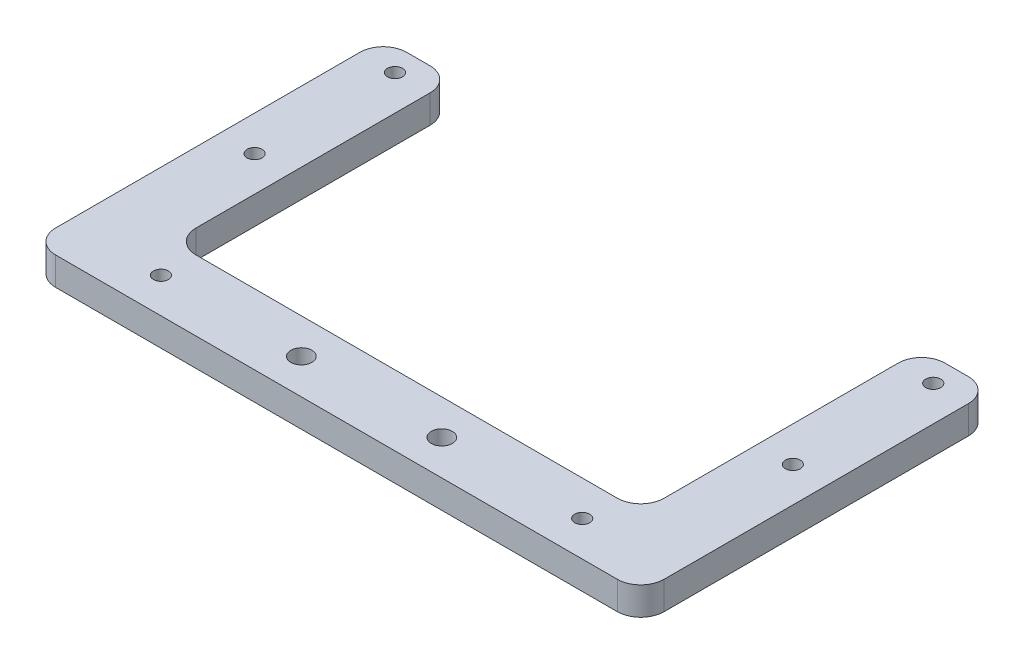
ISO-10303-21;
HEADER;
FILE_DESCRIPTION(('STEP AP214'),'2;1');
FILE_NAME('part.step','',(''),(''),'','','');
FILE_SCHEMA(('AUTOMOTIVE_DESIGN { 1 0 10303 214 1 1 1 1 }'));
ENDSEC;
DATA;
#1=APPLICATION_CONTEXT('core data for automotive mechanical design processes');
#2=APPLICATION_PROTOCOL_DEFINITION('international standard','automotive_design',2000,#1);
#3=PRODUCT_CONTEXT('',#1,'mechanical');
#4=PRODUCT('Part','Part','',(#3));
#5=PRODUCT_RELATED_PRODUCT_CATEGORY('part','',(#4));
#6=PRODUCT_DEFINITION_FORMATION('','',#4);
#7=PRODUCT_DEFINITION_CONTEXT('part definition',#1,'design');
#8=PRODUCT_DEFINITION('design','',#6,#7);
#9=PRODUCT_DEFINITION_SHAPE('','',#8);
#10=(LENGTH_UNIT() NAMED_UNIT(*) SI_UNIT(.MILLI.,.METRE.));
#11=(NAMED_UNIT(*) PLANE_ANGLE_UNIT() SI_UNIT($,.RADIAN.));
#12=(NAMED_UNIT(*) SI_UNIT($,.STERADIAN.) SOLID_ANGLE_UNIT());
#13=UNCERTAINTY_MEASURE_WITH_UNIT(LENGTH_MEASURE(1.E-05),#10,'distance_accuracy_value','');
#14=(GEOMETRIC_REPRESENTATION_CONTEXT(3) GLOBAL_UNCERTAINTY_ASSIGNED_CONTEXT((#13)) GLOBAL_UNIT_ASSIGNED_CONTEXT((#10,
#11,#12)) REPRESENTATION_CONTEXT('',''));
#15=CARTESIAN_POINT('',(0.,0.,0.));
#16=DIRECTION('',(0.,0.,1.));
#17=DIRECTION('',(1.,0.,0.));
#18=AXIS2_PLACEMENT_3D('',#15,#16,#17);
#19=CARTESIAN_POINT('',(0.,6.,0.));
#20=DIRECTION('',(0.,0.,1.));
#21=DIRECTION('',(1.,0.,0.));
#22=AXIS2_PLACEMENT_3D('',#19,#20,#21);
#23=PLANE('',#22);
#24=DIRECTION('',(-1.,0.,0.));
#25=VECTOR('',#24,1.);
#26=CARTESIAN_POINT('',(0.,6.,0.));
#27=LINE('',#26,#25);
#28=CARTESIAN_POINT('',(45.,6.,0.));
#29=VERTEX_POINT('',#28);
#30=CARTESIAN_POINT('',(-45.,6.,0.));
#31=VERTEX_POINT('',#30);
#32=EDGE_CURVE('E190',#29,#31,#27,.T.);
#33=ORIENTED_EDGE('',*,*,#32,.F.);
#34=DIRECTION('',(0.,-1.,0.));
#35=VECTOR('',#34,1.);
#36=CARTESIAN_POINT('',(45.,6.,0.));
#37=LINE('',#36,#35);
#38=CARTESIAN_POINT('',(45.,0.,0.));
#39=VERTEX_POINT('',#38);
#40=EDGE_CURVE('E218',#29,#39,#37,.T.);
#41=ORIENTED_EDGE('',*,*,#40,.T.);
#42=DIRECTION('',(-1.,0.,0.));
#43=VECTOR('',#42,1.);
#44=CARTESIAN_POINT('',(0.,0.,0.));
#45=LINE('',#44,#43);
#46=CARTESIAN_POINT('',(-45.,0.,0.));
#47=VERTEX_POINT('',#46);
#48=EDGE_CURVE('E176',#39,#47,#45,.T.);
#49=ORIENTED_EDGE('',*,*,#48,.T.);
#50=DIRECTION('',(0.,-1.,0.));
#51=VECTOR('',#50,1.);
#52=CARTESIAN_POINT('',(-45.,6.,0.));
#53=LINE('',#52,#51);
#54=EDGE_CURVE('E154',#47,#31,#53,.F.);
#55=ORIENTED_EDGE('',*,*,#54,.T.);
#56=EDGE_LOOP('',(#33,#41,#49,#55));
#57=FACE_BOUND('',#56,.T.);
#58=ADVANCED_FACE('F33',(#57),#23,.F.);
#59=CARTESIAN_POINT('',(-50.,6.,0.));
#60=DIRECTION('',(-1.,0.,0.));
#61=DIRECTION('',(0.,0.,1.));
#62=AXIS2_PLACEMENT_3D('',#59,#60,#61);
#63=PLANE('',#62);
#64=DIRECTION('',(0.,0.,-1.));
#65=VECTOR('',#64,1.);
#66=CARTESIAN_POINT('',(-50.,6.,0.));
#67=LINE('',#66,#65);
#68=CARTESIAN_POINT('',(-50.,6.,-4.99999999999999));
#69=VERTEX_POINT('',#68);
#70=CARTESIAN_POINT('',(-50.,6.,-55.));
#71=VERTEX_POINT('',#70);
#72=EDGE_CURVE('E168',#69,#71,#67,.T.);
#73=ORIENTED_EDGE('',*,*,#72,.F.);
#74=DIRECTION('',(0.,-1.,0.));
#75=VECTOR('',#74,1.);
#76=CARTESIAN_POINT('',(-50.,0.,-4.99999999999999));
#77=LINE('',#76,#75);
#78=CARTESIAN_POINT('',(-50.,0.,-4.99999999999999));
#79=VERTEX_POINT('',#78);
#80=EDGE_CURVE('E152',#69,#79,#77,.T.);
#81=ORIENTED_EDGE('',*,*,#80,.T.);
#82=DIRECTION('',(0.,0.,-1.));
#83=VECTOR('',#82,1.);
#84=CARTESIAN_POINT('',(-50.,0.,0.));
#85=LINE('',#84,#83);
#86=CARTESIAN_POINT('',(-50.,0.,-55.));
#87=VERTEX_POINT('',#86);
#88=EDGE_CURVE('E165',#79,#87,#85,.T.);
#89=ORIENTED_EDGE('',*,*,#88,.T.);
#90=DIRECTION('',(0.,-1.,0.));
#91=VECTOR('',#90,1.);
#92=CARTESIAN_POINT('',(-50.,6.,-55.));
#93=LINE('',#92,#91);
#94=EDGE_CURVE('E169',#87,#71,#93,.F.);
#95=ORIENTED_EDGE('',*,*,#94,.T.);
#96=EDGE_LOOP('',(#73,#81,#89,#95));
#97=FACE_BOUND('',#96,.T.);
#98=ADVANCED_FACE('F164',(#97),#63,.F.);
#99=CARTESIAN_POINT('',(-50.,6.,-60.));
#100=DIRECTION('',(0.,0.,1.));
#101=DIRECTION('',(1.,0.,0.));
#102=AXIS2_PLACEMENT_3D('',#99,#100,#101);
#103=PLANE('',#102);
#104=DIRECTION('',(-1.,0.,0.));
#105=VECTOR('',#104,1.);
#106=CARTESIAN_POINT('',(-50.,0.,-60.));
#107=LINE('',#106,#105);
#108=CARTESIAN_POINT('',(-55.,0.,-60.));
#109=VERTEX_POINT('',#108);
#110=CARTESIAN_POINT('',(-60.,0.,-60.));
#111=VERTEX_POINT('',#110);
#112=EDGE_CURVE('E175',#109,#111,#107,.T.);
#113=ORIENTED_EDGE('',*,*,#112,.T.);
#114=DIRECTION('',(0.,-1.,0.));
#115=VECTOR('',#114,1.);
#116=CARTESIAN_POINT('',(-60.,6.,-60.));
#117=LINE('',#116,#115);
#118=CARTESIAN_POINT('',(-60.,6.,-60.));
#119=VERTEX_POINT('',#118);
#120=EDGE_CURVE('E159',#111,#119,#117,.F.);
#121=ORIENTED_EDGE('',*,*,#120,.T.);
#122=DIRECTION('',(-1.,0.,0.));
#123=VECTOR('',#122,1.);
#124=CARTESIAN_POINT('',(-50.,6.,-60.));
#125=LINE('',#124,#123);
#126=CARTESIAN_POINT('',(-55.,6.,-60.));
#127=VERTEX_POINT('',#126);
#128=EDGE_CURVE('E269',#127,#119,#125,.T.);
#129=ORIENTED_EDGE('',*,*,#128,.F.);
#130=DIRECTION('',(0.,-1.,0.));
#131=VECTOR('',#130,1.);
#132=CARTESIAN_POINT('',(-55.,6.,-60.));
#133=LINE('',#132,#131);
#134=EDGE_CURVE('E213',#127,#109,#133,.T.);
#135=ORIENTED_EDGE('',*,*,#134,.T.);
#136=EDGE_LOOP('',(#113,#121,#129,#135));
#137=FACE_BOUND('',#136,.T.);
#138=ADVANCED_FACE('F359',(#137),#103,.F.);
#139=CARTESIAN_POINT('',(-65.,6.,-60.));
#140=DIRECTION('',(1.,0.,0.));
#141=DIRECTION('',(0.,0.,-1.));
#142=AXIS2_PLACEMENT_3D('',#139,#140,#141);
#143=PLANE('',#142);
#144=DIRECTION('',(0.,0.,1.));
#145=VECTOR('',#144,1.);
#146=CARTESIAN_POINT('',(-65.,0.,-60.));
#147=LINE('',#146,#145);
#148=CARTESIAN_POINT('',(-65.,0.,-55.));
#149=VERTEX_POINT('',#148);
#150=CARTESIAN_POINT('',(-65.,0.,10.));
#151=VERTEX_POINT('',#150);
#152=EDGE_CURVE('E179',#149,#151,#147,.T.);
#153=ORIENTED_EDGE('',*,*,#152,.T.);
#154=DIRECTION('',(0.,-1.,0.));
#155=VECTOR('',#154,1.);
#156=CARTESIAN_POINT('',(-65.,6.,10.));
#157=LINE('',#156,#155);
#158=CARTESIAN_POINT('',(-65.,6.,10.));
#159=VERTEX_POINT('',#158);
#160=EDGE_CURVE('E205',#151,#159,#157,.F.);
#161=ORIENTED_EDGE('',*,*,#160,.T.);
#162=DIRECTION('',(0.,0.,1.));
#163=VECTOR('',#162,1.);
#164=CARTESIAN_POINT('',(-65.,6.,-60.));
#165=LINE('',#164,#163);
#166=CARTESIAN_POINT('',(-65.,6.,-55.));
#167=VERTEX_POINT('',#166);
#168=EDGE_CURVE('E277',#167,#159,#165,.T.);
#169=ORIENTED_EDGE('',*,*,#168,.F.);
#170=DIRECTION('',(0.,-1.,0.));
#171=VECTOR('',#170,1.);
#172=CARTESIAN_POINT('',(-65.,6.,-55.));
#173=LINE('',#172,#171);
#174=EDGE_CURVE('E202',#167,#149,#173,.T.);
#175=ORIENTED_EDGE('',*,*,#174,.T.);
#176=EDGE_LOOP('',(#153,#161,#169,#175));
#177=FACE_BOUND('',#176,.T.);
#178=ADVANCED_FACE('F458',(#177),#143,.F.);
#179=CARTESIAN_POINT('',(-65.,6.,15.));
#180=DIRECTION('',(0.,0.,-1.));
#181=DIRECTION('',(-1.,0.,0.));
#182=AXIS2_PLACEMENT_3D('',#179,#180,#181);
#183=PLANE('',#182);
#184=DIRECTION('',(1.,0.,0.));
#185=VECTOR('',#184,1.);
#186=CARTESIAN_POINT('',(-65.,0.,15.));
#187=LINE('',#186,#185);
#188=CARTESIAN_POINT('',(-60.,0.,15.));
#189=VERTEX_POINT('',#188);
#190=CARTESIAN_POINT('',(60.,0.,15.));
#191=VERTEX_POINT('',#190);
#192=EDGE_CURVE('E187',#189,#191,#187,.T.);
#193=ORIENTED_EDGE('',*,*,#192,.T.);
#194=DIRECTION('',(0.,-1.,0.));
#195=VECTOR('',#194,1.);
#196=CARTESIAN_POINT('',(60.,6.,15.));
#197=LINE('',#196,#195);
#198=CARTESIAN_POINT('',(60.,6.,15.));
#199=VERTEX_POINT('',#198);
#200=EDGE_CURVE('E237',#191,#199,#197,.F.);
#201=ORIENTED_EDGE('',*,*,#200,.T.);
#202=DIRECTION('',(1.,0.,0.));
#203=VECTOR('',#202,1.);
#204=CARTESIAN_POINT('',(-65.,6.,15.));
#205=LINE('',#204,#203);
#206=CARTESIAN_POINT('',(-60.,6.,15.));
#207=VERTEX_POINT('',#206);
#208=EDGE_CURVE('E191',#207,#199,#205,.T.);
#209=ORIENTED_EDGE('',*,*,#208,.F.);
#210=DIRECTION('',(0.,-1.,0.));
#211=VECTOR('',#210,1.);
#212=CARTESIAN_POINT('',(-60.,6.,15.));
#213=LINE('',#212,#211);
#214=EDGE_CURVE('E194',#207,#189,#213,.T.);
#215=ORIENTED_EDGE('',*,*,#214,.T.);
#216=EDGE_LOOP('',(#193,#201,#209,#215));
#217=FACE_BOUND('',#216,.T.);
#218=ADVANCED_FACE('F332',(#217),#183,.F.);
#219=CARTESIAN_POINT('',(0.,6.,0.));
#220=DIRECTION('',(0.,1.,0.));
#221=DIRECTION('',(0.,0.,1.));
#222=AXIS2_PLACEMENT_3D('',#219,#220,#221);
#223=PLANE('',#222);
#224=CARTESIAN_POINT('',(15.,6.,7.5));
#225=DIRECTION('',(0.,-1.,0.));
#226=DIRECTION('',(0.,0.,1.));
#227=AXIS2_PLACEMENT_3D('',#224,#225,#226);
#228=CIRCLE('',#227,2.25);
#229=CARTESIAN_POINT('',(15.,6.,9.74999999999999));
#230=VERTEX_POINT('',#229);
#231=EDGE_CURVE('E300',#230,#230,#228,.T.);
#232=ORIENTED_EDGE('',*,*,#231,.T.);
#233=EDGE_LOOP('',(#232));
#234=FACE_BOUND('',#233,.T.);
#235=CARTESIAN_POINT('',(57.5,6.,-25.));
#236=DIRECTION('',(0.,-1.,0.));
#237=DIRECTION('',(0.,0.,1.));
#238=AXIS2_PLACEMENT_3D('',#235,#236,#237);
#239=CIRCLE('',#238,1.6);
#240=CARTESIAN_POINT('',(57.5,6.,-23.4));
#241=VERTEX_POINT('',#240);
#242=EDGE_CURVE('E402',#241,#241,#239,.T.);
#243=ORIENTED_EDGE('',*,*,#242,.T.);
#244=EDGE_LOOP('',(#243));
#245=FACE_BOUND('',#244,.T.);
#246=CARTESIAN_POINT('',(57.5,6.,-55.));
#247=DIRECTION('',(0.,-1.,0.));
#248=DIRECTION('',(0.,0.,1.));
#249=AXIS2_PLACEMENT_3D('',#246,#247,#248);
#250=CIRCLE('',#249,1.6);
#251=CARTESIAN_POINT('',(57.5,6.,-53.4));
#252=VERTEX_POINT('',#251);
#253=EDGE_CURVE('E389',#252,#252,#250,.T.);
#254=ORIENTED_EDGE('',*,*,#253,.T.);
#255=EDGE_LOOP('',(#254));
#256=FACE_BOUND('',#255,.T.);
#257=CARTESIAN_POINT('',(45.,6.,7.5));
#258=DIRECTION('',(0.,-1.,0.));
#259=DIRECTION('',(0.,0.,1.));
#260=AXIS2_PLACEMENT_3D('',#257,#258,#259);
#261=CIRCLE('',#260,1.6);
#262=CARTESIAN_POINT('',(45.,6.,9.1));
#263=VERTEX_POINT('',#262);
#264=EDGE_CURVE('E396',#263,#263,#261,.T.);
#265=ORIENTED_EDGE('',*,*,#264,.T.);
#266=EDGE_LOOP('',(#265));
#267=FACE_BOUND('',#266,.T.);
#268=CARTESIAN_POINT('',(-15.,6.,7.5));
#269=DIRECTION('',(0.,1.,0.));
#270=DIRECTION('',(0.,0.,1.));
#271=AXIS2_PLACEMENT_3D('',#268,#269,#270);
#272=CIRCLE('',#271,2.25);
#273=CARTESIAN_POINT('',(-15.,6.,9.74999999999999));
#274=VERTEX_POINT('',#273);
#275=EDGE_CURVE('E307',#274,#274,#272,.T.);
#276=ORIENTED_EDGE('',*,*,#275,.F.);
#277=EDGE_LOOP('',(#276));
#278=FACE_BOUND('',#277,.T.);
#279=CARTESIAN_POINT('',(-57.5,6.,-25.));
#280=DIRECTION('',(0.,1.,0.));
#281=DIRECTION('',(0.,0.,1.));
#282=AXIS2_PLACEMENT_3D('',#279,#280,#281);
#283=CIRCLE('',#282,1.6);
#284=CARTESIAN_POINT('',(-57.5,6.,-23.4));
#285=VERTEX_POINT('',#284);
#286=EDGE_CURVE('E314',#285,#285,#283,.T.);
#287=ORIENTED_EDGE('',*,*,#286,.F.);
#288=EDGE_LOOP('',(#287));
#289=FACE_BOUND('',#288,.T.);
#290=CARTESIAN_POINT('',(-57.5,6.,-55.));
#291=DIRECTION('',(0.,1.,0.));
#292=DIRECTION('',(0.,0.,1.));
#293=AXIS2_PLACEMENT_3D('',#290,#291,#292);
#294=CIRCLE('',#293,1.6);
#295=CARTESIAN_POINT('',(-57.5,6.,-53.4));
#296=VERTEX_POINT('',#295);
#297=EDGE_CURVE('E272',#296,#296,#294,.T.);
#298=ORIENTED_EDGE('',*,*,#297,.F.);
#299=EDGE_LOOP('',(#298));
#300=FACE_BOUND('',#299,.T.);
#301=CARTESIAN_POINT('',(-45.,6.,7.5));
#302=DIRECTION('',(0.,1.,0.));
#303=DIRECTION('',(0.,0.,1.));
#304=AXIS2_PLACEMENT_3D('',#301,#302,#303);
#305=CIRCLE('',#304,1.6);
#306=CARTESIAN_POINT('',(-45.,6.,9.1));
#307=VERTEX_POINT('',#306);
#308=EDGE_CURVE('E319',#307,#307,#305,.T.);
#309=ORIENTED_EDGE('',*,*,#308,.F.);
#310=EDGE_LOOP('',(#309));
#311=FACE_BOUND('',#310,.T.);
#312=ORIENTED_EDGE('',*,*,#208,.T.);
#313=CARTESIAN_POINT('',(60.,6.,10.));
#314=DIRECTION('',(0.,1.,0.));
#315=DIRECTION('',(0.,0.,1.));
#316=AXIS2_PLACEMENT_3D('',#313,#314,#315);
#317=CIRCLE('',#316,5.);
#318=CARTESIAN_POINT('',(65.,6.,10.));
#319=VERTEX_POINT('',#318);
#320=EDGE_CURVE('E242',#199,#319,#317,.T.);
#321=ORIENTED_EDGE('',*,*,#320,.T.);
#322=DIRECTION('',(0.,0.,1.));
#323=VECTOR('',#322,1.);
#324=CARTESIAN_POINT('',(65.,6.,-60.));
#325=LINE('',#324,#323);
#326=CARTESIAN_POINT('',(65.,6.,-55.));
#327=VERTEX_POINT('',#326);
#328=EDGE_CURVE('E258',#327,#319,#325,.T.);
#329=ORIENTED_EDGE('',*,*,#328,.F.);
#330=CARTESIAN_POINT('',(60.,6.,-55.));
#331=DIRECTION('',(0.,1.,0.));
#332=DIRECTION('',(0.,0.,1.));
#333=AXIS2_PLACEMENT_3D('',#330,#331,#332);
#334=CIRCLE('',#333,5.);
#335=CARTESIAN_POINT('',(60.,6.,-60.));
#336=VERTEX_POINT('',#335);
#337=EDGE_CURVE('E48',#327,#336,#334,.T.);
#338=ORIENTED_EDGE('',*,*,#337,.T.);
#339=DIRECTION('',(1.,0.,0.));
#340=VECTOR('',#339,1.);
#341=CARTESIAN_POINT('',(50.,6.,-60.));
#342=LINE('',#341,#340);
#343=CARTESIAN_POINT('',(55.,6.,-60.));
#344=VERTEX_POINT('',#343);
#345=EDGE_CURVE('E385',#344,#336,#342,.T.);
#346=ORIENTED_EDGE('',*,*,#345,.F.);
#347=CARTESIAN_POINT('',(55.,6.,-55.));
#348=DIRECTION('',(0.,1.,0.));
#349=DIRECTION('',(0.,0.,1.));
#350=AXIS2_PLACEMENT_3D('',#347,#348,#349);
#351=CIRCLE('',#350,5.);
#352=CARTESIAN_POINT('',(50.,6.,-55.));
#353=VERTEX_POINT('',#352);
#354=EDGE_CURVE('E239',#344,#353,#351,.T.);
#355=ORIENTED_EDGE('',*,*,#354,.T.);
#356=DIRECTION('',(0.,0.,-1.));
#357=VECTOR('',#356,1.);
#358=CARTESIAN_POINT('',(50.,6.,0.));
#359=LINE('',#358,#357);
#360=CARTESIAN_POINT('',(50.,6.,-5.00000000000001));
#361=VERTEX_POINT('',#360);
#362=EDGE_CURVE('E266',#361,#353,#359,.T.);
#363=ORIENTED_EDGE('',*,*,#362,.F.);
#364=CARTESIAN_POINT('',(45.,6.,-5.00000000000001));
#365=DIRECTION('',(0.,1.,0.));
#366=DIRECTION('',(0.,0.,1.));
#367=AXIS2_PLACEMENT_3D('',#364,#365,#366);
#368=CIRCLE('',#367,5.);
#369=EDGE_CURVE('E11',#361,#29,#368,.F.);
#370=ORIENTED_EDGE('',*,*,#369,.T.);
#371=ORIENTED_EDGE('',*,*,#32,.T.);
#372=CARTESIAN_POINT('',(-45.,6.,-4.99999999999999));
#373=DIRECTION('',(0.,1.,0.));
#374=DIRECTION('',(0.,0.,1.));
#375=AXIS2_PLACEMENT_3D('',#372,#373,#374);
#376=CIRCLE('',#375,5.);
#377=EDGE_CURVE('E158',#31,#69,#376,.F.);
#378=ORIENTED_EDGE('',*,*,#377,.T.);
#379=ORIENTED_EDGE('',*,*,#72,.T.);
#380=CARTESIAN_POINT('',(-55.,6.,-55.));
#381=DIRECTION('',(0.,1.,0.));
#382=DIRECTION('',(0.,0.,1.));
#383=AXIS2_PLACEMENT_3D('',#380,#381,#382);
#384=CIRCLE('',#383,5.);
#385=EDGE_CURVE('E207',#71,#127,#384,.T.);
#386=ORIENTED_EDGE('',*,*,#385,.T.);
#387=ORIENTED_EDGE('',*,*,#128,.T.);
#388=CARTESIAN_POINT('',(-60.,6.,-55.));
#389=DIRECTION('',(0.,1.,0.));
#390=DIRECTION('',(0.,0.,1.));
#391=AXIS2_PLACEMENT_3D('',#388,#389,#390);
#392=CIRCLE('',#391,5.);
#393=EDGE_CURVE('E209',#119,#167,#392,.T.);
#394=ORIENTED_EDGE('',*,*,#393,.T.);
#395=ORIENTED_EDGE('',*,*,#168,.T.);
#396=CARTESIAN_POINT('',(-60.,6.,10.));
#397=DIRECTION('',(0.,1.,0.));
#398=DIRECTION('',(0.,0.,1.));
#399=AXIS2_PLACEMENT_3D('',#396,#397,#398);
#400=CIRCLE('',#399,5.);
#401=EDGE_CURVE('E211',#159,#207,#400,.T.);
#402=ORIENTED_EDGE('',*,*,#401,.T.);
#403=EDGE_LOOP('',(#312,#321,#329,#338,#346,#355,#363,#370,#371,#378,#379,#386,#387,#394,#395,#402));
#404=FACE_BOUND('',#403,.T.);
#405=ADVANCED_FACE('F265',(#234,#245,#256,#267,#278,#289,#300,#311,#404),#223,.T.);
#406=CARTESIAN_POINT('',(0.,0.,0.));
#407=DIRECTION('',(0.,1.,0.));
#408=DIRECTION('',(0.,0.,1.));
#409=AXIS2_PLACEMENT_3D('',#406,#407,#408);
#410=PLANE('',#409);
#411=CARTESIAN_POINT('',(15.,0.,7.5));
#412=DIRECTION('',(0.,-1.,0.));
#413=DIRECTION('',(0.,0.,1.));
#414=AXIS2_PLACEMENT_3D('',#411,#412,#413);
#415=CIRCLE('',#414,2.25);
#416=CARTESIAN_POINT('',(15.,0.,9.74999999999999));
#417=VERTEX_POINT('',#416);
#418=EDGE_CURVE('E296',#417,#417,#415,.T.);
#419=ORIENTED_EDGE('',*,*,#418,.F.);
#420=EDGE_LOOP('',(#419));
#421=FACE_BOUND('',#420,.T.);
#422=CARTESIAN_POINT('',(57.5,0.,-25.));
#423=DIRECTION('',(0.,-1.,0.));
#424=DIRECTION('',(0.,0.,1.));
#425=AXIS2_PLACEMENT_3D('',#422,#423,#424);
#426=CIRCLE('',#425,1.6);
#427=CARTESIAN_POINT('',(57.5,0.,-23.4));
#428=VERTEX_POINT('',#427);
#429=EDGE_CURVE('E393',#428,#428,#426,.T.);
#430=ORIENTED_EDGE('',*,*,#429,.F.);
#431=EDGE_LOOP('',(#430));
#432=FACE_BOUND('',#431,.T.);
#433=CARTESIAN_POINT('',(57.5,0.,-55.));
#434=DIRECTION('',(0.,-1.,0.));
#435=DIRECTION('',(0.,0.,1.));
#436=AXIS2_PLACEMENT_3D('',#433,#434,#435);
#437=CIRCLE('',#436,1.6);
#438=CARTESIAN_POINT('',(57.5,0.,-53.4));
#439=VERTEX_POINT('',#438);
#440=EDGE_CURVE('E392',#439,#439,#437,.T.);
#441=ORIENTED_EDGE('',*,*,#440,.F.);
#442=EDGE_LOOP('',(#441));
#443=FACE_BOUND('',#442,.T.);
#444=CARTESIAN_POINT('',(45.,0.,7.5));
#445=DIRECTION('',(0.,-1.,0.));
#446=DIRECTION('',(0.,0.,1.));
#447=AXIS2_PLACEMENT_3D('',#444,#445,#446);
#448=CIRCLE('',#447,1.6);
#449=CARTESIAN_POINT('',(45.,0.,9.1));
#450=VERTEX_POINT('',#449);
#451=EDGE_CURVE('E399',#450,#450,#448,.T.);
#452=ORIENTED_EDGE('',*,*,#451,.F.);
#453=EDGE_LOOP('',(#452));
#454=FACE_BOUND('',#453,.T.);
#455=CARTESIAN_POINT('',(-15.,0.,7.5));
#456=DIRECTION('',(0.,1.,0.));
#457=DIRECTION('',(0.,0.,1.));
#458=AXIS2_PLACEMENT_3D('',#455,#456,#457);
#459=CIRCLE('',#458,2.25);
#460=CARTESIAN_POINT('',(-15.,0.,9.74999999999999));
#461=VERTEX_POINT('',#460);
#462=EDGE_CURVE('E181',#461,#461,#459,.T.);
#463=ORIENTED_EDGE('',*,*,#462,.T.);
#464=EDGE_LOOP('',(#463));
#465=FACE_BOUND('',#464,.T.);
#466=CARTESIAN_POINT('',(-57.5,0.,-25.));
#467=DIRECTION('',(0.,1.,0.));
#468=DIRECTION('',(0.,0.,1.));
#469=AXIS2_PLACEMENT_3D('',#466,#467,#468);
#470=CIRCLE('',#469,1.6);
#471=CARTESIAN_POINT('',(-57.5,0.,-23.4));
#472=VERTEX_POINT('',#471);
#473=EDGE_CURVE('E311',#472,#472,#470,.T.);
#474=ORIENTED_EDGE('',*,*,#473,.T.);
#475=EDGE_LOOP('',(#474));
#476=FACE_BOUND('',#475,.T.);
#477=CARTESIAN_POINT('',(-57.5,0.,-55.));
#478=DIRECTION('',(0.,1.,0.));
#479=DIRECTION('',(0.,0.,1.));
#480=AXIS2_PLACEMENT_3D('',#477,#478,#479);
#481=CIRCLE('',#480,1.6);
#482=CARTESIAN_POINT('',(-57.5,0.,-53.4));
#483=VERTEX_POINT('',#482);
#484=EDGE_CURVE('E321',#483,#483,#481,.T.);
#485=ORIENTED_EDGE('',*,*,#484,.T.);
#486=EDGE_LOOP('',(#485));
#487=FACE_BOUND('',#486,.T.);
#488=CARTESIAN_POINT('',(-45.,0.,7.5));
#489=DIRECTION('',(0.,1.,0.));
#490=DIRECTION('',(0.,0.,1.));
#491=AXIS2_PLACEMENT_3D('',#488,#489,#490);
#492=CIRCLE('',#491,1.6);
#493=CARTESIAN_POINT('',(-45.,0.,9.1));
#494=VERTEX_POINT('',#493);
#495=EDGE_CURVE('E310',#494,#494,#492,.T.);
#496=ORIENTED_EDGE('',*,*,#495,.T.);
#497=EDGE_LOOP('',(#496));
#498=FACE_BOUND('',#497,.T.);
#499=DIRECTION('',(0.,0.,1.));
#500=VECTOR('',#499,1.);
#501=CARTESIAN_POINT('',(65.,0.,-60.));
#502=LINE('',#501,#500);
#503=CARTESIAN_POINT('',(65.,0.,-55.));
#504=VERTEX_POINT('',#503);
#505=CARTESIAN_POINT('',(65.,0.,10.));
#506=VERTEX_POINT('',#505);
#507=EDGE_CURVE('E292',#504,#506,#502,.T.);
#508=ORIENTED_EDGE('',*,*,#507,.T.);
#509=CARTESIAN_POINT('',(60.,0.,10.));
#510=DIRECTION('',(0.,1.,0.));
#511=DIRECTION('',(0.,0.,1.));
#512=AXIS2_PLACEMENT_3D('',#509,#510,#511);
#513=CIRCLE('',#512,5.);
#514=EDGE_CURVE('E235',#506,#191,#513,.F.);
#515=ORIENTED_EDGE('',*,*,#514,.T.);
#516=ORIENTED_EDGE('',*,*,#192,.F.);
#517=CARTESIAN_POINT('',(-60.,0.,10.));
#518=DIRECTION('',(0.,1.,0.));
#519=DIRECTION('',(0.,0.,1.));
#520=AXIS2_PLACEMENT_3D('',#517,#518,#519);
#521=CIRCLE('',#520,5.);
#522=EDGE_CURVE('E200',#189,#151,#521,.F.);
#523=ORIENTED_EDGE('',*,*,#522,.T.);
#524=ORIENTED_EDGE('',*,*,#152,.F.);
#525=CARTESIAN_POINT('',(-60.,0.,-55.));
#526=DIRECTION('',(0.,1.,0.));
#527=DIRECTION('',(0.,0.,1.));
#528=AXIS2_PLACEMENT_3D('',#525,#526,#527);
#529=CIRCLE('',#528,5.);
#530=EDGE_CURVE('E198',#149,#111,#529,.F.);
#531=ORIENTED_EDGE('',*,*,#530,.T.);
#532=ORIENTED_EDGE('',*,*,#112,.F.);
#533=CARTESIAN_POINT('',(-55.,0.,-55.));
#534=DIRECTION('',(0.,1.,0.));
#535=DIRECTION('',(0.,0.,1.));
#536=AXIS2_PLACEMENT_3D('',#533,#534,#535);
#537=CIRCLE('',#536,5.);
#538=EDGE_CURVE('E174',#109,#87,#537,.F.);
#539=ORIENTED_EDGE('',*,*,#538,.T.);
#540=ORIENTED_EDGE('',*,*,#88,.F.);
#541=CARTESIAN_POINT('',(-45.,0.,-4.99999999999999));
#542=DIRECTION('',(0.,1.,0.));
#543=DIRECTION('',(0.,0.,1.));
#544=AXIS2_PLACEMENT_3D('',#541,#542,#543);
#545=CIRCLE('',#544,5.);
#546=EDGE_CURVE('E148',#79,#47,#545,.T.);
#547=ORIENTED_EDGE('',*,*,#546,.T.);
#548=ORIENTED_EDGE('',*,*,#48,.F.);
#549=CARTESIAN_POINT('',(45.,0.,-5.00000000000001));
#550=DIRECTION('',(0.,1.,0.));
#551=DIRECTION('',(0.,0.,1.));
#552=AXIS2_PLACEMENT_3D('',#549,#550,#551);
#553=CIRCLE('',#552,5.);
#554=CARTESIAN_POINT('',(50.,0.,-5.00000000000001));
#555=VERTEX_POINT('',#554);
#556=EDGE_CURVE('E41',#39,#555,#553,.T.);
#557=ORIENTED_EDGE('',*,*,#556,.T.);
#558=DIRECTION('',(0.,0.,-1.));
#559=VECTOR('',#558,1.);
#560=CARTESIAN_POINT('',(50.,0.,0.));
#561=LINE('',#560,#559);
#562=CARTESIAN_POINT('',(50.,0.,-55.));
#563=VERTEX_POINT('',#562);
#564=EDGE_CURVE('E249',#555,#563,#561,.T.);
#565=ORIENTED_EDGE('',*,*,#564,.T.);
#566=CARTESIAN_POINT('',(55.,0.,-55.));
#567=DIRECTION('',(0.,1.,0.));
#568=DIRECTION('',(0.,0.,1.));
#569=AXIS2_PLACEMENT_3D('',#566,#567,#568);
#570=CIRCLE('',#569,5.);
#571=CARTESIAN_POINT('',(55.,0.,-60.));
#572=VERTEX_POINT('',#571);
#573=EDGE_CURVE('E231',#563,#572,#570,.F.);
#574=ORIENTED_EDGE('',*,*,#573,.T.);
#575=DIRECTION('',(1.,0.,0.));
#576=VECTOR('',#575,1.);
#577=CARTESIAN_POINT('',(50.,0.,-60.));
#578=LINE('',#577,#576);
#579=CARTESIAN_POINT('',(60.,0.,-60.));
#580=VERTEX_POINT('',#579);
#581=EDGE_CURVE('E259',#572,#580,#578,.T.);
#582=ORIENTED_EDGE('',*,*,#581,.T.);
#583=CARTESIAN_POINT('',(60.,0.,-55.));
#584=DIRECTION('',(0.,1.,0.));
#585=DIRECTION('',(0.,0.,1.));
#586=AXIS2_PLACEMENT_3D('',#583,#584,#585);
#587=CIRCLE('',#586,5.);
#588=EDGE_CURVE('E233',#580,#504,#587,.F.);
#589=ORIENTED_EDGE('',*,*,#588,.T.);
#590=EDGE_LOOP('',(#508,#515,#516,#523,#524,#531,#532,#539,#540,#547,#548,#557,#565,#574,#582,#589));
#591=FACE_BOUND('',#590,.T.);
#592=ADVANCED_FACE('F172',(#421,#432,#443,#454,#465,#476,#487,#498,#591),#410,.F.);
#593=CARTESIAN_POINT('',(-45.,6.,-4.99999999999999));
#594=DIRECTION('',(0.,1.,0.));
#595=DIRECTION('',(0.,0.,1.));
#596=AXIS2_PLACEMENT_3D('',#593,#594,#595);
#597=CYLINDRICAL_SURFACE('',#596,5.);
#598=ORIENTED_EDGE('',*,*,#377,.F.);
#599=ORIENTED_EDGE('',*,*,#54,.F.);
#600=ORIENTED_EDGE('',*,*,#546,.F.);
#601=ORIENTED_EDGE('',*,*,#80,.F.);
#602=EDGE_LOOP('',(#598,#599,#600,#601));
#603=FACE_BOUND('',#602,.T.);
#604=ADVANCED_FACE('F151',(#603),#597,.F.);
#605=CARTESIAN_POINT('',(-60.,6.,10.));
#606=DIRECTION('',(0.,-1.,0.));
#607=DIRECTION('',(0.,0.,-1.));
#608=AXIS2_PLACEMENT_3D('',#605,#606,#607);
#609=CYLINDRICAL_SURFACE('',#608,5.);
#610=ORIENTED_EDGE('',*,*,#401,.F.);
#611=ORIENTED_EDGE('',*,*,#160,.F.);
#612=ORIENTED_EDGE('',*,*,#522,.F.);
#613=ORIENTED_EDGE('',*,*,#214,.F.);
#614=EDGE_LOOP('',(#610,#611,#612,#613));
#615=FACE_BOUND('',#614,.T.);
#616=ADVANCED_FACE('F365',(#615),#609,.T.);
#617=CARTESIAN_POINT('',(-60.,6.,-55.));
#618=DIRECTION('',(0.,-1.,0.));
#619=DIRECTION('',(0.,0.,-1.));
#620=AXIS2_PLACEMENT_3D('',#617,#618,#619);
#621=CYLINDRICAL_SURFACE('',#620,5.);
#622=ORIENTED_EDGE('',*,*,#393,.F.);
#623=ORIENTED_EDGE('',*,*,#120,.F.);
#624=ORIENTED_EDGE('',*,*,#530,.F.);
#625=ORIENTED_EDGE('',*,*,#174,.F.);
#626=EDGE_LOOP('',(#622,#623,#624,#625));
#627=FACE_BOUND('',#626,.T.);
#628=ADVANCED_FACE('F349',(#627),#621,.T.);
#629=CARTESIAN_POINT('',(-55.,6.,-55.));
#630=DIRECTION('',(0.,-1.,0.));
#631=DIRECTION('',(0.,0.,-1.));
#632=AXIS2_PLACEMENT_3D('',#629,#630,#631);
#633=CYLINDRICAL_SURFACE('',#632,5.);
#634=ORIENTED_EDGE('',*,*,#385,.F.);
#635=ORIENTED_EDGE('',*,*,#94,.F.);
#636=ORIENTED_EDGE('',*,*,#538,.F.);
#637=ORIENTED_EDGE('',*,*,#134,.F.);
#638=EDGE_LOOP('',(#634,#635,#636,#637));
#639=FACE_BOUND('',#638,.T.);
#640=ADVANCED_FACE('F339',(#639),#633,.T.);
#641=CARTESIAN_POINT('',(-45.,0.,7.5));
#642=DIRECTION('',(0.,1.,0.));
#643=DIRECTION('',(0.,0.,1.));
#644=AXIS2_PLACEMENT_3D('',#641,#642,#643);
#645=CYLINDRICAL_SURFACE('',#644,1.6);
#646=ORIENTED_EDGE('',*,*,#495,.F.);
#647=EDGE_LOOP('',(#646));
#648=FACE_BOUND('',#647,.T.);
#649=ORIENTED_EDGE('',*,*,#308,.T.);
#650=EDGE_LOOP('',(#649));
#651=FACE_BOUND('',#650,.T.);
#652=ADVANCED_FACE('F337',(#648,#651),#645,.F.);
#653=CARTESIAN_POINT('',(-57.5,0.,-55.));
#654=DIRECTION('',(0.,1.,0.));
#655=DIRECTION('',(0.,0.,1.));
#656=AXIS2_PLACEMENT_3D('',#653,#654,#655);
#657=CYLINDRICAL_SURFACE('',#656,1.6);
#658=ORIENTED_EDGE('',*,*,#484,.F.);
#659=EDGE_LOOP('',(#658));
#660=FACE_BOUND('',#659,.T.);
#661=ORIENTED_EDGE('',*,*,#297,.T.);
#662=EDGE_LOOP('',(#661));
#663=FACE_BOUND('',#662,.T.);
#664=ADVANCED_FACE('F328',(#660,#663),#657,.F.);
#665=CARTESIAN_POINT('',(-57.5,0.,-25.));
#666=DIRECTION('',(0.,1.,0.));
#667=DIRECTION('',(0.,0.,1.));
#668=AXIS2_PLACEMENT_3D('',#665,#666,#667);
#669=CYLINDRICAL_SURFACE('',#668,1.6);
#670=ORIENTED_EDGE('',*,*,#473,.F.);
#671=EDGE_LOOP('',(#670));
#672=FACE_BOUND('',#671,.T.);
#673=ORIENTED_EDGE('',*,*,#286,.T.);
#674=EDGE_LOOP('',(#673));
#675=FACE_BOUND('',#674,.T.);
#676=ADVANCED_FACE('F346',(#672,#675),#669,.F.);
#677=CARTESIAN_POINT('',(-15.,0.,7.5));
#678=DIRECTION('',(0.,1.,0.));
#679=DIRECTION('',(0.,0.,1.));
#680=AXIS2_PLACEMENT_3D('',#677,#678,#679);
#681=CYLINDRICAL_SURFACE('',#680,2.25);
#682=ORIENTED_EDGE('',*,*,#462,.F.);
#683=EDGE_LOOP('',(#682));
#684=FACE_BOUND('',#683,.T.);
#685=ORIENTED_EDGE('',*,*,#275,.T.);
#686=EDGE_LOOP('',(#685));
#687=FACE_BOUND('',#686,.T.);
#688=ADVANCED_FACE('F435',(#684,#687),#681,.F.);
#689=CARTESIAN_POINT('',(65.,6.,-60.));
#690=DIRECTION('',(1.,0.,0.));
#691=DIRECTION('',(0.,0.,-1.));
#692=AXIS2_PLACEMENT_3D('',#689,#690,#691);
#693=PLANE('',#692);
#694=ORIENTED_EDGE('',*,*,#328,.T.);
#695=DIRECTION('',(0.,-1.,0.));
#696=VECTOR('',#695,1.);
#697=CARTESIAN_POINT('',(65.,0.,10.));
#698=LINE('',#697,#696);
#699=EDGE_CURVE('E228',#319,#506,#698,.T.);
#700=ORIENTED_EDGE('',*,*,#699,.T.);
#701=ORIENTED_EDGE('',*,*,#507,.F.);
#702=DIRECTION('',(0.,-1.,0.));
#703=VECTOR('',#702,1.);
#704=CARTESIAN_POINT('',(65.,6.,-55.));
#705=LINE('',#704,#703);
#706=EDGE_CURVE('E226',#504,#327,#705,.F.);
#707=ORIENTED_EDGE('',*,*,#706,.T.);
#708=EDGE_LOOP('',(#694,#700,#701,#707));
#709=FACE_BOUND('',#708,.T.);
#710=ADVANCED_FACE('F291',(#709),#693,.T.);
#711=CARTESIAN_POINT('',(50.,6.,-60.));
#712=DIRECTION('',(0.,0.,-1.));
#713=DIRECTION('',(-1.,0.,0.));
#714=AXIS2_PLACEMENT_3D('',#711,#712,#713);
#715=PLANE('',#714);
#716=ORIENTED_EDGE('',*,*,#345,.T.);
#717=DIRECTION('',(0.,-1.,0.));
#718=VECTOR('',#717,1.);
#719=CARTESIAN_POINT('',(60.,6.,-60.));
#720=LINE('',#719,#718);
#721=EDGE_CURVE('E245',#336,#580,#720,.T.);
#722=ORIENTED_EDGE('',*,*,#721,.T.);
#723=ORIENTED_EDGE('',*,*,#581,.F.);
#724=DIRECTION('',(0.,-1.,0.));
#725=VECTOR('',#724,1.);
#726=CARTESIAN_POINT('',(55.,6.,-60.));
#727=LINE('',#726,#725);
#728=EDGE_CURVE('E55',#572,#344,#727,.F.);
#729=ORIENTED_EDGE('',*,*,#728,.T.);
#730=EDGE_LOOP('',(#716,#722,#723,#729));
#731=FACE_BOUND('',#730,.T.);
#732=ADVANCED_FACE('F384',(#731),#715,.T.);
#733=CARTESIAN_POINT('',(50.,6.,0.));
#734=DIRECTION('',(-1.,0.,0.));
#735=DIRECTION('',(0.,0.,1.));
#736=AXIS2_PLACEMENT_3D('',#733,#734,#735);
#737=PLANE('',#736);
#738=ORIENTED_EDGE('',*,*,#564,.F.);
#739=DIRECTION('',(0.,-1.,0.));
#740=VECTOR('',#739,1.);
#741=CARTESIAN_POINT('',(50.,6.,-5.00000000000001));
#742=LINE('',#741,#740);
#743=EDGE_CURVE('E224',#555,#361,#742,.F.);
#744=ORIENTED_EDGE('',*,*,#743,.T.);
#745=ORIENTED_EDGE('',*,*,#362,.T.);
#746=DIRECTION('',(0.,-1.,0.));
#747=VECTOR('',#746,1.);
#748=CARTESIAN_POINT('',(50.,6.,-55.));
#749=LINE('',#748,#747);
#750=EDGE_CURVE('E221',#353,#563,#749,.T.);
#751=ORIENTED_EDGE('',*,*,#750,.T.);
#752=EDGE_LOOP('',(#738,#744,#745,#751));
#753=FACE_BOUND('',#752,.T.);
#754=ADVANCED_FACE('F254',(#753),#737,.T.);
#755=CARTESIAN_POINT('',(45.,6.,-5.00000000000001));
#756=DIRECTION('',(0.,-1.,0.));
#757=DIRECTION('',(0.,0.,-1.));
#758=AXIS2_PLACEMENT_3D('',#755,#756,#757);
#759=CYLINDRICAL_SURFACE('',#758,5.);
#760=ORIENTED_EDGE('',*,*,#369,.F.);
#761=ORIENTED_EDGE('',*,*,#743,.F.);
#762=ORIENTED_EDGE('',*,*,#556,.F.);
#763=ORIENTED_EDGE('',*,*,#40,.F.);
#764=EDGE_LOOP('',(#760,#761,#762,#763));
#765=FACE_BOUND('',#764,.T.);
#766=ADVANCED_FACE('F262',(#765),#759,.F.);
#767=CARTESIAN_POINT('',(60.,6.,10.));
#768=DIRECTION('',(0.,1.,0.));
#769=DIRECTION('',(0.,0.,1.));
#770=AXIS2_PLACEMENT_3D('',#767,#768,#769);
#771=CYLINDRICAL_SURFACE('',#770,5.);
#772=ORIENTED_EDGE('',*,*,#320,.F.);
#773=ORIENTED_EDGE('',*,*,#200,.F.);
#774=ORIENTED_EDGE('',*,*,#514,.F.);
#775=ORIENTED_EDGE('',*,*,#699,.F.);
#776=EDGE_LOOP('',(#772,#773,#774,#775));
#777=FACE_BOUND('',#776,.T.);
#778=ADVANCED_FACE('F288',(#777),#771,.T.);
#779=CARTESIAN_POINT('',(60.,6.,-55.));
#780=DIRECTION('',(0.,-1.,0.));
#781=DIRECTION('',(0.,0.,-1.));
#782=AXIS2_PLACEMENT_3D('',#779,#780,#781);
#783=CYLINDRICAL_SURFACE('',#782,5.);
#784=ORIENTED_EDGE('',*,*,#337,.F.);
#785=ORIENTED_EDGE('',*,*,#706,.F.);
#786=ORIENTED_EDGE('',*,*,#588,.F.);
#787=ORIENTED_EDGE('',*,*,#721,.F.);
#788=EDGE_LOOP('',(#784,#785,#786,#787));
#789=FACE_BOUND('',#788,.T.);
#790=ADVANCED_FACE('F375',(#789),#783,.T.);
#791=CARTESIAN_POINT('',(55.,6.,-55.));
#792=DIRECTION('',(0.,-1.,0.));
#793=DIRECTION('',(0.,0.,-1.));
#794=AXIS2_PLACEMENT_3D('',#791,#792,#793);
#795=CYLINDRICAL_SURFACE('',#794,5.);
#796=ORIENTED_EDGE('',*,*,#354,.F.);
#797=ORIENTED_EDGE('',*,*,#728,.F.);
#798=ORIENTED_EDGE('',*,*,#573,.F.);
#799=ORIENTED_EDGE('',*,*,#750,.F.);
#800=EDGE_LOOP('',(#796,#797,#798,#799));
#801=FACE_BOUND('',#800,.T.);
#802=ADVANCED_FACE('F35',(#801),#795,.T.);
#803=CARTESIAN_POINT('',(45.,0.,7.5));
#804=DIRECTION('',(0.,1.,0.));
#805=DIRECTION('',(0.,0.,1.));
#806=AXIS2_PLACEMENT_3D('',#803,#804,#805);
#807=CYLINDRICAL_SURFACE('',#806,1.6);
#808=ORIENTED_EDGE('',*,*,#451,.T.);
#809=EDGE_LOOP('',(#808));
#810=FACE_BOUND('',#809,.T.);
#811=ORIENTED_EDGE('',*,*,#264,.F.);
#812=EDGE_LOOP('',(#811));
#813=FACE_BOUND('',#812,.T.);
#814=ADVANCED_FACE('F381',(#810,#813),#807,.F.);
#815=CARTESIAN_POINT('',(57.5,0.,-55.));
#816=DIRECTION('',(0.,1.,0.));
#817=DIRECTION('',(0.,0.,1.));
#818=AXIS2_PLACEMENT_3D('',#815,#816,#817);
#819=CYLINDRICAL_SURFACE('',#818,1.6);
#820=ORIENTED_EDGE('',*,*,#440,.T.);
#821=EDGE_LOOP('',(#820));
#822=FACE_BOUND('',#821,.T.);
#823=ORIENTED_EDGE('',*,*,#253,.F.);
#824=EDGE_LOOP('',(#823));
#825=FACE_BOUND('',#824,.T.);
#826=ADVANCED_FACE('F419',(#822,#825),#819,.F.);
#827=CARTESIAN_POINT('',(57.5,0.,-25.));
#828=DIRECTION('',(0.,1.,0.));
#829=DIRECTION('',(0.,0.,1.));
#830=AXIS2_PLACEMENT_3D('',#827,#828,#829);
#831=CYLINDRICAL_SURFACE('',#830,1.6);
#832=ORIENTED_EDGE('',*,*,#429,.T.);
#833=EDGE_LOOP('',(#832));
#834=FACE_BOUND('',#833,.T.);
#835=ORIENTED_EDGE('',*,*,#242,.F.);
#836=EDGE_LOOP('',(#835));
#837=FACE_BOUND('',#836,.T.);
#838=ADVANCED_FACE('F413',(#834,#837),#831,.F.);
#839=CARTESIAN_POINT('',(15.,0.,7.5));
#840=DIRECTION('',(0.,1.,0.));
#841=DIRECTION('',(0.,0.,1.));
#842=AXIS2_PLACEMENT_3D('',#839,#840,#841);
#843=CYLINDRICAL_SURFACE('',#842,2.25);
#844=ORIENTED_EDGE('',*,*,#418,.T.);
#845=EDGE_LOOP('',(#844));
#846=FACE_BOUND('',#845,.T.);
#847=ORIENTED_EDGE('',*,*,#231,.F.);
#848=EDGE_LOOP('',(#847));
#849=FACE_BOUND('',#848,.T.);
#850=ADVANCED_FACE('F411',(#846,#849),#843,.F.);
#851=CLOSED_SHELL('',(#58,#98,#138,#178,#218,#405,#592,#604,#616,#628,#640,#652,#664,#676,#688,
#710,#732,#754,#766,#778,#790,#802,#814,#826,#838,#850));
#852=MANIFOLD_SOLID_BREP('B2',#851);
#853=ADVANCED_BREP_SHAPE_REPRESENTATION('',(#18,#852),#14);
#854=SHAPE_DEFINITION_REPRESENTATION(#9,#853);
ENDSEC;
END-ISO-10303-21;
